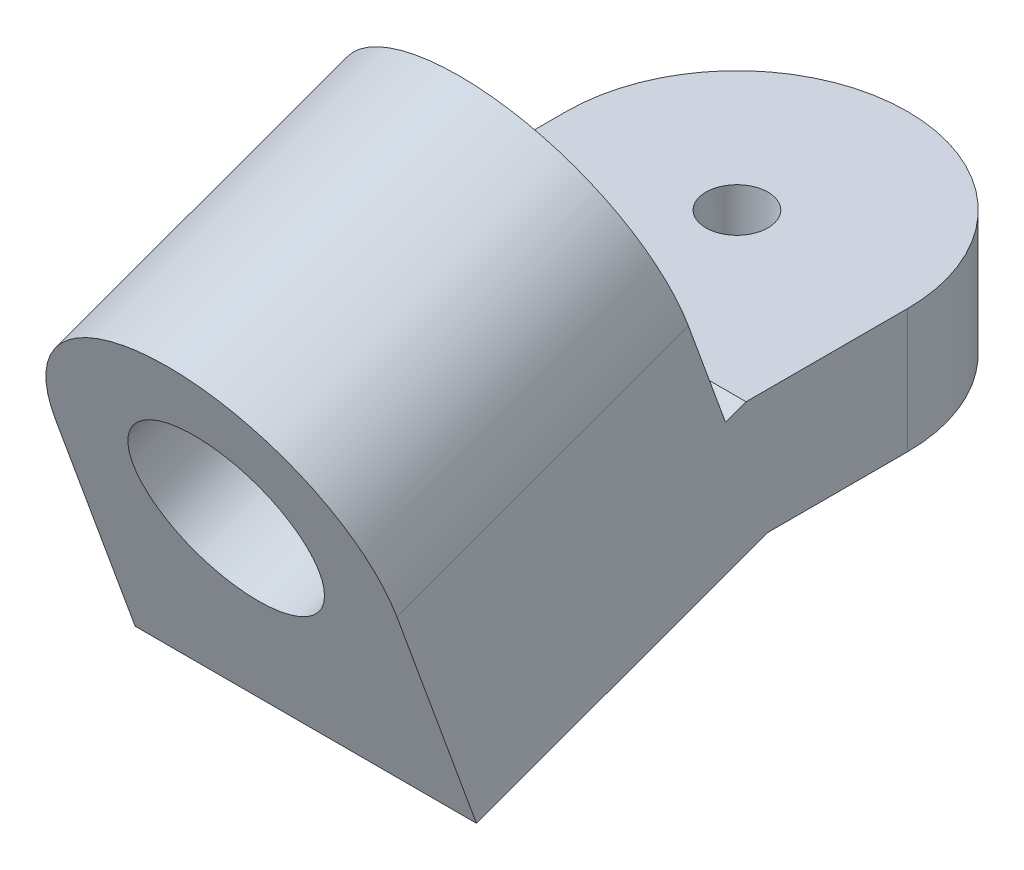
ISO-10303-21;
HEADER;
FILE_DESCRIPTION(('STEP AP214'),'2;1');
FILE_NAME('part.step','',(''),(''),'','','');
FILE_SCHEMA(('AUTOMOTIVE_DESIGN { 1 0 10303 214 1 1 1 1 }'));
ENDSEC;
DATA;
#1=APPLICATION_CONTEXT('core data for automotive mechanical design processes');
#2=APPLICATION_PROTOCOL_DEFINITION('international standard','automotive_design',2000,#1);
#3=PRODUCT_CONTEXT('',#1,'mechanical');
#4=PRODUCT('Part','Part','',(#3));
#5=PRODUCT_RELATED_PRODUCT_CATEGORY('part','',(#4));
#6=PRODUCT_DEFINITION_FORMATION('','',#4);
#7=PRODUCT_DEFINITION_CONTEXT('part definition',#1,'design');
#8=PRODUCT_DEFINITION('design','',#6,#7);
#9=PRODUCT_DEFINITION_SHAPE('','',#8);
#10=(LENGTH_UNIT() NAMED_UNIT(*) SI_UNIT(.MILLI.,.METRE.));
#11=(NAMED_UNIT(*) PLANE_ANGLE_UNIT() SI_UNIT($,.RADIAN.));
#12=(NAMED_UNIT(*) SI_UNIT($,.STERADIAN.) SOLID_ANGLE_UNIT());
#13=UNCERTAINTY_MEASURE_WITH_UNIT(LENGTH_MEASURE(1.E-05),#10,'distance_accuracy_value','');
#14=(GEOMETRIC_REPRESENTATION_CONTEXT(3) GLOBAL_UNCERTAINTY_ASSIGNED_CONTEXT((#13)) GLOBAL_UNIT_ASSIGNED_CONTEXT((#10,
#11,#12)) REPRESENTATION_CONTEXT('',''));
#15=CARTESIAN_POINT('',(0.,0.,0.));
#16=DIRECTION('',(0.,0.,1.));
#17=DIRECTION('',(1.,0.,0.));
#18=AXIS2_PLACEMENT_3D('',#15,#16,#17);
#19=CARTESIAN_POINT('',(5.5,3.75877048314363,11.3680805733027));
#20=DIRECTION('',(0.,-0.939692620785908,-0.34202014332567));
#21=DIRECTION('',(0.,0.34202014332567,-0.939692620785908));
#22=AXIS2_PLACEMENT_3D('',#19,#20,#21);
#23=PLANE('',#22);
#24=DIRECTION('',(-1.,0.,0.));
#25=VECTOR('',#24,1.);
#26=CARTESIAN_POINT('',(5.5,3.75877048314363,11.3680805733027));
#27=LINE('',#26,#25);
#28=CARTESIAN_POINT('',(5.5,3.75877048314363,11.3680805733027));
#29=VERTEX_POINT('',#28);
#30=CARTESIAN_POINT('',(-5.5,3.75877048314363,11.3680805733027));
#31=VERTEX_POINT('',#30);
#32=EDGE_CURVE('E134',#29,#31,#27,.T.);
#33=ORIENTED_EDGE('',*,*,#32,.F.);
#34=DIRECTION('',(0.,-0.34202014332567,0.939692620785908));
#35=VECTOR('',#34,1.);
#36=CARTESIAN_POINT('',(5.5,3.75877048314363,11.3680805733027));
#37=LINE('',#36,#35);
#38=CARTESIAN_POINT('',(5.5,4.,10.7053079228339));
#39=VERTEX_POINT('',#38);
#40=EDGE_CURVE('E111',#39,#29,#37,.T.);
#41=ORIENTED_EDGE('',*,*,#40,.F.);
#42=DIRECTION('',(-1.,0.,0.));
#43=VECTOR('',#42,1.);
#44=CARTESIAN_POINT('',(5.5,4.,10.7053079228339));
#45=LINE('',#44,#43);
#46=CARTESIAN_POINT('',(-5.5,4.,10.7053079228339));
#47=VERTEX_POINT('',#46);
#48=EDGE_CURVE('E158',#39,#47,#45,.T.);
#49=ORIENTED_EDGE('',*,*,#48,.T.);
#50=DIRECTION('',(0.,-0.34202014332567,0.939692620785908));
#51=VECTOR('',#50,1.);
#52=CARTESIAN_POINT('',(-5.5,3.75877048314363,11.3680805733027));
#53=LINE('',#52,#51);
#54=EDGE_CURVE('E159',#47,#31,#53,.T.);
#55=ORIENTED_EDGE('',*,*,#54,.T.);
#56=EDGE_LOOP('',(#33,#41,#49,#55));
#57=FACE_BOUND('',#56,.T.);
#58=ADVANCED_FACE('F32',(#57),#23,.F.);
#59=CARTESIAN_POINT('',(0.,-3.4202014332567,5.5));
#60=DIRECTION('',(0.,1.,0.));
#61=DIRECTION('',(0.,0.,1.));
#62=AXIS2_PLACEMENT_3D('',#59,#60,#61);
#63=CYLINDRICAL_SURFACE('',#62,1.);
#64=CARTESIAN_POINT('',(0.,4.,5.5));
#65=DIRECTION('',(0.,1.,0.));
#66=DIRECTION('',(0.,0.,1.));
#67=AXIS2_PLACEMENT_3D('',#64,#65,#66);
#68=CIRCLE('',#67,1.);
#69=CARTESIAN_POINT('',(0.,4.,6.5));
#70=VERTEX_POINT('',#69);
#71=EDGE_CURVE('E143',#70,#70,#68,.T.);
#72=ORIENTED_EDGE('',*,*,#71,.T.);
#73=EDGE_LOOP('',(#72));
#74=FACE_BOUND('',#73,.T.);
#75=CARTESIAN_POINT('',(0.,2.,5.5));
#76=DIRECTION('',(0.,-1.,0.));
#77=DIRECTION('',(0.,0.,-1.));
#78=AXIS2_PLACEMENT_3D('',#75,#76,#77);
#79=CIRCLE('',#78,1.);
#80=CARTESIAN_POINT('',(0.,2.,4.5));
#81=VERTEX_POINT('',#80);
#82=EDGE_CURVE('E36',#81,#81,#79,.F.);
#83=ORIENTED_EDGE('',*,*,#82,.F.);
#84=EDGE_LOOP('',(#83));
#85=FACE_BOUND('',#84,.T.);
#86=ADVANCED_FACE('F223',(#74,#85),#63,.F.);
#87=CARTESIAN_POINT('',(5.5,-3.4202014332567,19.3969262078591));
#88=DIRECTION('',(0.,-0.342020143325671,0.939692620785908));
#89=DIRECTION('',(0.,-0.939692620785908,-0.342020143325671));
#90=AXIS2_PLACEMENT_3D('',#87,#88,#89);
#91=PLANE('',#90);
#92=DIRECTION('',(0.,0.939692620785908,0.342020143325671));
#93=VECTOR('',#92,1.);
#94=CARTESIAN_POINT('',(-5.5,-3.4202014332567,19.3969262078591));
#95=LINE('',#94,#93);
#96=CARTESIAN_POINT('',(-5.5,-3.4202014332567,19.3969262078591));
#97=VERTEX_POINT('',#96);
#98=CARTESIAN_POINT('',(-5.5,3.62749322263757,21.9620772828016));
#99=VERTEX_POINT('',#98);
#100=EDGE_CURVE('E162',#97,#99,#95,.T.);
#101=ORIENTED_EDGE('',*,*,#100,.F.);
#102=DIRECTION('',(-1.,0.,0.));
#103=VECTOR('',#102,1.);
#104=CARTESIAN_POINT('',(5.5,-3.4202014332567,19.3969262078591));
#105=LINE('',#104,#103);
#106=CARTESIAN_POINT('',(5.5,-3.4202014332567,19.3969262078591));
#107=VERTEX_POINT('',#106);
#108=EDGE_CURVE('E175',#107,#97,#105,.T.);
#109=ORIENTED_EDGE('',*,*,#108,.F.);
#110=DIRECTION('',(0.,0.939692620785908,0.342020143325671));
#111=VECTOR('',#110,1.);
#112=CARTESIAN_POINT('',(5.5,-3.4202014332567,19.3969262078591));
#113=LINE('',#112,#111);
#114=CARTESIAN_POINT('',(5.5,3.62749322263757,21.9620772828016));
#115=VERTEX_POINT('',#114);
#116=EDGE_CURVE('E148',#107,#115,#113,.T.);
#117=ORIENTED_EDGE('',*,*,#116,.T.);
#118=CARTESIAN_POINT('',(0.,3.62749322263757,21.9620772828016));
#119=DIRECTION('',(0.,-0.342020143325671,0.939692620785908));
#120=DIRECTION('',(0.,-0.939692620785908,-0.342020143325671));
#121=AXIS2_PLACEMENT_3D('',#118,#119,#120);
#122=CIRCLE('',#121,5.5);
#123=EDGE_CURVE('E123',#115,#99,#122,.T.);
#124=ORIENTED_EDGE('',*,*,#123,.T.);
#125=EDGE_LOOP('',(#101,#109,#117,#124));
#126=FACE_BOUND('',#125,.T.);
#127=CARTESIAN_POINT('',(0.,3.62749322263757,21.9620772828016));
#128=DIRECTION('',(0.,-0.342020143325671,0.939692620785908));
#129=DIRECTION('',(0.,-0.939692620785908,-0.342020143325671));
#130=AXIS2_PLACEMENT_3D('',#127,#128,#129);
#131=CIRCLE('',#130,3.);
#132=CARTESIAN_POINT('',(0.,0.808415360279851,20.9360168528246));
#133=VERTEX_POINT('',#132);
#134=EDGE_CURVE('E208',#133,#133,#131,.T.);
#135=ORIENTED_EDGE('',*,*,#134,.F.);
#136=EDGE_LOOP('',(#135));
#137=FACE_BOUND('',#136,.T.);
#138=ADVANCED_FACE('F221',(#126,#137),#91,.T.);
#139=CARTESIAN_POINT('',(5.5,0.,10.));
#140=DIRECTION('',(0.,-0.939692620785908,-0.34202014332567));
#141=DIRECTION('',(0.,0.34202014332567,-0.939692620785908));
#142=AXIS2_PLACEMENT_3D('',#139,#140,#141);
#143=PLANE('',#142);
#144=DIRECTION('',(0.,-0.34202014332567,0.939692620785908));
#145=VECTOR('',#144,1.);
#146=CARTESIAN_POINT('',(-5.5,0.,10.));
#147=LINE('',#146,#145);
#148=CARTESIAN_POINT('',(-5.5,0.,10.));
#149=VERTEX_POINT('',#148);
#150=EDGE_CURVE('E164',#149,#97,#147,.T.);
#151=ORIENTED_EDGE('',*,*,#150,.F.);
#152=DIRECTION('',(-1.,0.,0.));
#153=VECTOR('',#152,1.);
#154=CARTESIAN_POINT('',(5.5,0.,10.));
#155=LINE('',#154,#153);
#156=CARTESIAN_POINT('',(5.5,0.,10.));
#157=VERTEX_POINT('',#156);
#158=EDGE_CURVE('E172',#157,#149,#155,.T.);
#159=ORIENTED_EDGE('',*,*,#158,.F.);
#160=DIRECTION('',(0.,-0.34202014332567,0.939692620785908));
#161=VECTOR('',#160,1.);
#162=CARTESIAN_POINT('',(5.5,0.,10.));
#163=LINE('',#162,#161);
#164=EDGE_CURVE('E151',#157,#107,#163,.T.);
#165=ORIENTED_EDGE('',*,*,#164,.T.);
#166=ORIENTED_EDGE('',*,*,#108,.T.);
#167=EDGE_LOOP('',(#151,#159,#165,#166));
#168=FACE_BOUND('',#167,.T.);
#169=ADVANCED_FACE('F198',(#168),#143,.T.);
#170=CARTESIAN_POINT('',(5.5,0.,0.));
#171=DIRECTION('',(0.,-1.,0.));
#172=DIRECTION('',(0.,0.,-1.));
#173=AXIS2_PLACEMENT_3D('',#170,#171,#172);
#174=PLANE('',#173);
#175=CARTESIAN_POINT('',(0.,0.,5.5));
#176=DIRECTION('',(0.,-1.,0.));
#177=DIRECTION('',(0.,0.,-1.));
#178=AXIS2_PLACEMENT_3D('',#175,#176,#177);
#179=CIRCLE('',#178,2.25);
#180=CARTESIAN_POINT('',(0.,0.,3.25));
#181=VERTEX_POINT('',#180);
#182=EDGE_CURVE('E137',#181,#181,#179,.T.);
#183=ORIENTED_EDGE('',*,*,#182,.F.);
#184=EDGE_LOOP('',(#183));
#185=FACE_BOUND('',#184,.T.);
#186=DIRECTION('',(0.,0.,1.));
#187=VECTOR('',#186,1.);
#188=CARTESIAN_POINT('',(-5.5,0.,0.));
#189=LINE('',#188,#187);
#190=CARTESIAN_POINT('',(-5.5,0.,5.5));
#191=VERTEX_POINT('',#190);
#192=EDGE_CURVE('E167',#191,#149,#189,.T.);
#193=ORIENTED_EDGE('',*,*,#192,.F.);
#194=CARTESIAN_POINT('',(0.,0.,5.5));
#195=DIRECTION('',(0.,-1.,0.));
#196=DIRECTION('',(0.,0.,-1.));
#197=AXIS2_PLACEMENT_3D('',#194,#195,#196);
#198=CIRCLE('',#197,5.5);
#199=CARTESIAN_POINT('',(0.,0.,0.));
#200=VERTEX_POINT('',#199);
#201=EDGE_CURVE('E182',#191,#200,#198,.T.);
#202=ORIENTED_EDGE('',*,*,#201,.T.);
#203=CARTESIAN_POINT('',(0.,0.,5.5));
#204=DIRECTION('',(0.,-1.,0.));
#205=DIRECTION('',(0.,0.,-1.));
#206=AXIS2_PLACEMENT_3D('',#203,#204,#205);
#207=CIRCLE('',#206,5.5);
#208=CARTESIAN_POINT('',(5.5,0.,5.5));
#209=VERTEX_POINT('',#208);
#210=EDGE_CURVE('E180',#200,#209,#207,.T.);
#211=ORIENTED_EDGE('',*,*,#210,.T.);
#212=DIRECTION('',(0.,0.,1.));
#213=VECTOR('',#212,1.);
#214=CARTESIAN_POINT('',(5.5,0.,0.));
#215=LINE('',#214,#213);
#216=EDGE_CURVE('E154',#209,#157,#215,.T.);
#217=ORIENTED_EDGE('',*,*,#216,.T.);
#218=ORIENTED_EDGE('',*,*,#158,.T.);
#219=EDGE_LOOP('',(#193,#202,#211,#217,#218));
#220=FACE_BOUND('',#219,.T.);
#221=ADVANCED_FACE('F194',(#185,#220),#174,.T.);
#222=CARTESIAN_POINT('',(5.5,4.,0.));
#223=DIRECTION('',(0.,-1.,0.));
#224=DIRECTION('',(0.,0.,-1.));
#225=AXIS2_PLACEMENT_3D('',#222,#223,#224);
#226=PLANE('',#225);
#227=ORIENTED_EDGE('',*,*,#71,.F.);
#228=EDGE_LOOP('',(#227));
#229=FACE_BOUND('',#228,.T.);
#230=CARTESIAN_POINT('',(0.,4.,5.5));
#231=DIRECTION('',(0.,-1.,0.));
#232=DIRECTION('',(0.,0.,-1.));
#233=AXIS2_PLACEMENT_3D('',#230,#231,#232);
#234=CIRCLE('',#233,5.5);
#235=CARTESIAN_POINT('',(5.5,4.,5.5));
#236=VERTEX_POINT('',#235);
#237=CARTESIAN_POINT('',(0.,4.,0.));
#238=VERTEX_POINT('',#237);
#239=EDGE_CURVE('E49',#236,#238,#234,.F.);
#240=ORIENTED_EDGE('',*,*,#239,.T.);
#241=CARTESIAN_POINT('',(0.,4.,5.5));
#242=DIRECTION('',(0.,-1.,0.));
#243=DIRECTION('',(0.,0.,-1.));
#244=AXIS2_PLACEMENT_3D('',#241,#242,#243);
#245=CIRCLE('',#244,5.5);
#246=CARTESIAN_POINT('',(-5.5,4.,5.5));
#247=VERTEX_POINT('',#246);
#248=EDGE_CURVE('E41',#238,#247,#245,.F.);
#249=ORIENTED_EDGE('',*,*,#248,.T.);
#250=DIRECTION('',(0.,0.,1.));
#251=VECTOR('',#250,1.);
#252=CARTESIAN_POINT('',(-5.5,4.,0.));
#253=LINE('',#252,#251);
#254=EDGE_CURVE('E149',#247,#47,#253,.T.);
#255=ORIENTED_EDGE('',*,*,#254,.T.);
#256=ORIENTED_EDGE('',*,*,#48,.F.);
#257=DIRECTION('',(0.,0.,1.));
#258=VECTOR('',#257,1.);
#259=CARTESIAN_POINT('',(5.5,4.,0.));
#260=LINE('',#259,#258);
#261=EDGE_CURVE('E156',#236,#39,#260,.T.);
#262=ORIENTED_EDGE('',*,*,#261,.F.);
#263=EDGE_LOOP('',(#240,#249,#255,#256,#262));
#264=FACE_BOUND('',#263,.T.);
#265=ADVANCED_FACE('F205',(#229,#264),#226,.F.);
#266=CARTESIAN_POINT('',(5.5,0.,0.));
#267=DIRECTION('',(-1.,0.,0.));
#268=DIRECTION('',(0.,0.,1.));
#269=AXIS2_PLACEMENT_3D('',#266,#267,#268);
#270=PLANE('',#269);
#271=ORIENTED_EDGE('',*,*,#164,.F.);
#272=ORIENTED_EDGE('',*,*,#216,.F.);
#273=DIRECTION('',(0.,-1.,0.));
#274=VECTOR('',#273,1.);
#275=CARTESIAN_POINT('',(5.5,4.,5.5));
#276=LINE('',#275,#274);
#277=EDGE_CURVE('E11',#209,#236,#276,.F.);
#278=ORIENTED_EDGE('',*,*,#277,.T.);
#279=ORIENTED_EDGE('',*,*,#261,.T.);
#280=ORIENTED_EDGE('',*,*,#40,.T.);
#281=DIRECTION('',(0.,0.939692620785908,0.342020143325671));
#282=VECTOR('',#281,1.);
#283=CARTESIAN_POINT('',(5.5,3.75877048314363,11.3680805733027));
#284=LINE('',#283,#282);
#285=CARTESIAN_POINT('',(5.5,7.04769465589429,12.5651510749425));
#286=VERTEX_POINT('',#285);
#287=EDGE_CURVE('E103',#29,#286,#284,.T.);
#288=ORIENTED_EDGE('',*,*,#287,.T.);
#289=DIRECTION('',(0.,-0.342020143325671,0.939692620785908));
#290=VECTOR('',#289,1.);
#291=CARTESIAN_POINT('',(5.5,7.04769465589429,12.5651510749425));
#292=LINE('',#291,#290);
#293=EDGE_CURVE('E108',#286,#115,#292,.T.);
#294=ORIENTED_EDGE('',*,*,#293,.T.);
#295=ORIENTED_EDGE('',*,*,#116,.F.);
#296=EDGE_LOOP('',(#271,#272,#278,#279,#280,#288,#294,#295));
#297=FACE_BOUND('',#296,.T.);
#298=ADVANCED_FACE('F106',(#297),#270,.F.);
#299=CARTESIAN_POINT('',(-5.5,0.,0.));
#300=DIRECTION('',(-1.,0.,0.));
#301=DIRECTION('',(0.,0.,1.));
#302=AXIS2_PLACEMENT_3D('',#299,#300,#301);
#303=PLANE('',#302);
#304=ORIENTED_EDGE('',*,*,#100,.T.);
#305=DIRECTION('',(0.,-0.342020143325671,0.939692620785908));
#306=VECTOR('',#305,1.);
#307=CARTESIAN_POINT('',(-5.5,7.04769465589429,12.5651510749425));
#308=LINE('',#307,#306);
#309=CARTESIAN_POINT('',(-5.5,7.04769465589429,12.5651510749425));
#310=VERTEX_POINT('',#309);
#311=EDGE_CURVE('E124',#310,#99,#308,.T.);
#312=ORIENTED_EDGE('',*,*,#311,.F.);
#313=DIRECTION('',(0.,-0.939692620785907,-0.342020143325671));
#314=VECTOR('',#313,1.);
#315=CARTESIAN_POINT('',(-5.5,0.,10.));
#316=LINE('',#315,#314);
#317=EDGE_CURVE('E116',#310,#31,#316,.T.);
#318=ORIENTED_EDGE('',*,*,#317,.T.);
#319=ORIENTED_EDGE('',*,*,#54,.F.);
#320=ORIENTED_EDGE('',*,*,#254,.F.);
#321=DIRECTION('',(0.,-1.,0.));
#322=VECTOR('',#321,1.);
#323=CARTESIAN_POINT('',(-5.5,0.,5.5));
#324=LINE('',#323,#322);
#325=EDGE_CURVE('E177',#247,#191,#324,.T.);
#326=ORIENTED_EDGE('',*,*,#325,.T.);
#327=ORIENTED_EDGE('',*,*,#192,.T.);
#328=ORIENTED_EDGE('',*,*,#150,.T.);
#329=EDGE_LOOP('',(#304,#312,#318,#319,#320,#326,#327,#328));
#330=FACE_BOUND('',#329,.T.);
#331=ADVANCED_FACE('F201',(#330),#303,.T.);
#332=CARTESIAN_POINT('',(0.,4.,5.5));
#333=DIRECTION('',(0.,1.,0.));
#334=DIRECTION('',(0.,0.,1.));
#335=AXIS2_PLACEMENT_3D('',#332,#333,#334);
#336=CYLINDRICAL_SURFACE('',#335,5.5);
#337=DIRECTION('',(0.,-1.,0.));
#338=VECTOR('',#337,1.);
#339=CARTESIAN_POINT('',(0.,0.,0.));
#340=LINE('',#339,#338);
#341=EDGE_CURVE('E146',#238,#200,#340,.T.);
#342=ORIENTED_EDGE('',*,*,#341,.F.);
#343=ORIENTED_EDGE('',*,*,#239,.F.);
#344=ORIENTED_EDGE('',*,*,#277,.F.);
#345=ORIENTED_EDGE('',*,*,#210,.F.);
#346=EDGE_LOOP('',(#342,#343,#344,#345));
#347=FACE_BOUND('',#346,.T.);
#348=ADVANCED_FACE('F34',(#347),#336,.T.);
#349=CARTESIAN_POINT('',(0.,0.,5.5));
#350=DIRECTION('',(0.,-1.,0.));
#351=DIRECTION('',(0.,0.,-1.));
#352=AXIS2_PLACEMENT_3D('',#349,#350,#351);
#353=CYLINDRICAL_SURFACE('',#352,5.5);
#354=ORIENTED_EDGE('',*,*,#248,.F.);
#355=ORIENTED_EDGE('',*,*,#341,.T.);
#356=ORIENTED_EDGE('',*,*,#201,.F.);
#357=ORIENTED_EDGE('',*,*,#325,.F.);
#358=EDGE_LOOP('',(#354,#355,#356,#357));
#359=FACE_BOUND('',#358,.T.);
#360=ADVANCED_FACE('F188',(#359),#353,.T.);
#361=CARTESIAN_POINT('',(0.,2.,5.5));
#362=DIRECTION('',(0.,-1.,0.));
#363=DIRECTION('',(0.,0.,-1.));
#364=AXIS2_PLACEMENT_3D('',#361,#362,#363);
#365=PLANE('',#364);
#366=CARTESIAN_POINT('',(0.,2.,5.5));
#367=DIRECTION('',(0.,-1.,0.));
#368=DIRECTION('',(0.,0.,-1.));
#369=AXIS2_PLACEMENT_3D('',#366,#367,#368);
#370=CIRCLE('',#369,2.25);
#371=CARTESIAN_POINT('',(0.,2.,3.25));
#372=VERTEX_POINT('',#371);
#373=EDGE_CURVE('E138',#372,#372,#370,.T.);
#374=ORIENTED_EDGE('',*,*,#373,.T.);
#375=EDGE_LOOP('',(#374));
#376=FACE_BOUND('',#375,.T.);
#377=ORIENTED_EDGE('',*,*,#82,.T.);
#378=EDGE_LOOP('',(#377));
#379=FACE_BOUND('',#378,.T.);
#380=ADVANCED_FACE('F238',(#376,#379),#365,.T.);
#381=CARTESIAN_POINT('',(0.,2.,5.5));
#382=DIRECTION('',(0.,-1.,0.));
#383=DIRECTION('',(0.,0.,-1.));
#384=AXIS2_PLACEMENT_3D('',#381,#382,#383);
#385=CYLINDRICAL_SURFACE('',#384,2.25);
#386=ORIENTED_EDGE('',*,*,#373,.F.);
#387=EDGE_LOOP('',(#386));
#388=FACE_BOUND('',#387,.T.);
#389=ORIENTED_EDGE('',*,*,#182,.T.);
#390=EDGE_LOOP('',(#389));
#391=FACE_BOUND('',#390,.T.);
#392=ADVANCED_FACE('F243',(#388,#391),#385,.F.);
#393=CARTESIAN_POINT('',(0.,7.04769465589429,12.5651510749425));
#394=DIRECTION('',(0.,-0.342020143325671,0.939692620785908));
#395=DIRECTION('',(0.,-0.939692620785908,-0.342020143325671));
#396=AXIS2_PLACEMENT_3D('',#393,#394,#395);
#397=PLANE('',#396);
#398=CARTESIAN_POINT('',(0.,7.04769465589429,12.5651510749425));
#399=DIRECTION('',(0.,-0.342020143325671,0.939692620785908));
#400=DIRECTION('',(0.,-0.939692620785908,-0.342020143325671));
#401=AXIS2_PLACEMENT_3D('',#398,#399,#400);
#402=CIRCLE('',#401,3.);
#403=CARTESIAN_POINT('',(0.,4.22861679353657,11.5390906449655));
#404=VERTEX_POINT('',#403);
#405=EDGE_CURVE('E133',#404,#404,#402,.T.);
#406=ORIENTED_EDGE('',*,*,#405,.T.);
#407=EDGE_LOOP('',(#406));
#408=FACE_BOUND('',#407,.T.);
#409=ORIENTED_EDGE('',*,*,#287,.F.);
#410=ORIENTED_EDGE('',*,*,#32,.T.);
#411=ORIENTED_EDGE('',*,*,#317,.F.);
#412=CARTESIAN_POINT('',(0.,7.04769465589429,12.5651510749425));
#413=DIRECTION('',(0.,-0.342020143325671,0.939692620785908));
#414=DIRECTION('',(0.,-0.939692620785908,-0.342020143325671));
#415=AXIS2_PLACEMENT_3D('',#412,#413,#414);
#416=CIRCLE('',#415,5.5);
#417=EDGE_CURVE('E115',#286,#310,#416,.T.);
#418=ORIENTED_EDGE('',*,*,#417,.F.);
#419=EDGE_LOOP('',(#409,#410,#411,#418));
#420=FACE_BOUND('',#419,.T.);
#421=ADVANCED_FACE('F126',(#408,#420),#397,.F.);
#422=CARTESIAN_POINT('',(0.,7.04769465589429,12.5651510749425));
#423=DIRECTION('',(0.,-0.342020143325671,0.939692620785908));
#424=DIRECTION('',(0.,-0.939692620785908,-0.342020143325671));
#425=AXIS2_PLACEMENT_3D('',#422,#423,#424);
#426=CYLINDRICAL_SURFACE('',#425,5.5);
#427=ORIENTED_EDGE('',*,*,#123,.F.);
#428=ORIENTED_EDGE('',*,*,#293,.F.);
#429=ORIENTED_EDGE('',*,*,#417,.T.);
#430=ORIENTED_EDGE('',*,*,#311,.T.);
#431=EDGE_LOOP('',(#427,#428,#429,#430));
#432=FACE_BOUND('',#431,.T.);
#433=ADVANCED_FACE('F120',(#432),#426,.T.);
#434=CARTESIAN_POINT('',(0.,7.04769465589429,12.5651510749425));
#435=DIRECTION('',(0.,-0.342020143325671,0.939692620785908));
#436=DIRECTION('',(0.,-0.939692620785908,-0.342020143325671));
#437=AXIS2_PLACEMENT_3D('',#434,#435,#436);
#438=CYLINDRICAL_SURFACE('',#437,3.);
#439=ORIENTED_EDGE('',*,*,#405,.F.);
#440=EDGE_LOOP('',(#439));
#441=FACE_BOUND('',#440,.T.);
#442=ORIENTED_EDGE('',*,*,#134,.T.);
#443=EDGE_LOOP('',(#442));
#444=FACE_BOUND('',#443,.T.);
#445=ADVANCED_FACE('F215',(#441,#444),#438,.F.);
#446=CLOSED_SHELL('',(#58,#86,#138,#169,#221,#265,#298,#331,#348,#360,#380,#392,#421,#433,#445));
#447=MANIFOLD_SOLID_BREP('B2',#446);
#448=ADVANCED_BREP_SHAPE_REPRESENTATION('',(#18,#447),#14);
#449=SHAPE_DEFINITION_REPRESENTATION(#9,#448);
ENDSEC;
END-ISO-10303-21;
